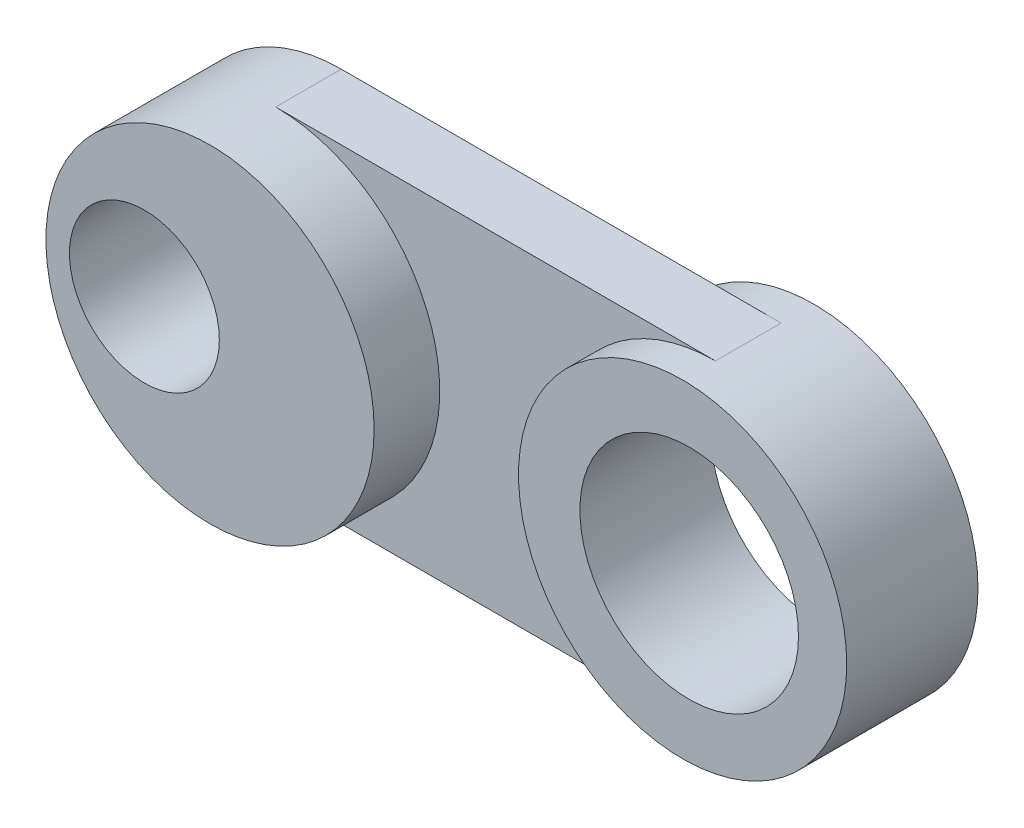
ISO-10303-21;
HEADER;
FILE_DESCRIPTION(('STEP AP214'),'2;1');
FILE_NAME('part.step','',(''),(''),'','','');
FILE_SCHEMA(('AUTOMOTIVE_DESIGN { 1 0 10303 214 1 1 1 1 }'));
ENDSEC;
DATA;
#1=APPLICATION_CONTEXT('core data for automotive mechanical design processes');
#2=APPLICATION_PROTOCOL_DEFINITION('international standard','automotive_design',2000,#1);
#3=PRODUCT_CONTEXT('',#1,'mechanical');
#4=PRODUCT('Part','Part','',(#3));
#5=PRODUCT_RELATED_PRODUCT_CATEGORY('part','',(#4));
#6=PRODUCT_DEFINITION_FORMATION('','',#4);
#7=PRODUCT_DEFINITION_CONTEXT('part definition',#1,'design');
#8=PRODUCT_DEFINITION('design','',#6,#7);
#9=PRODUCT_DEFINITION_SHAPE('','',#8);
#10=(LENGTH_UNIT() NAMED_UNIT(*) SI_UNIT(.MILLI.,.METRE.));
#11=(NAMED_UNIT(*) PLANE_ANGLE_UNIT() SI_UNIT($,.RADIAN.));
#12=(NAMED_UNIT(*) SI_UNIT($,.STERADIAN.) SOLID_ANGLE_UNIT());
#13=UNCERTAINTY_MEASURE_WITH_UNIT(LENGTH_MEASURE(1.E-05),#10,'distance_accuracy_value','');
#14=(GEOMETRIC_REPRESENTATION_CONTEXT(3) GLOBAL_UNCERTAINTY_ASSIGNED_CONTEXT((#13)) GLOBAL_UNIT_ASSIGNED_CONTEXT((#10,
#11,#12)) REPRESENTATION_CONTEXT('',''));
#15=CARTESIAN_POINT('',(0.,0.,0.));
#16=DIRECTION('',(0.,0.,1.));
#17=DIRECTION('',(1.,0.,0.));
#18=AXIS2_PLACEMENT_3D('',#15,#16,#17);
#19=CARTESIAN_POINT('',(0.,6.35,1.27));
#20=DIRECTION('',(0.,0.,-1.));
#21=DIRECTION('',(-1.,0.,0.));
#22=AXIS2_PLACEMENT_3D('',#19,#20,#21);
#23=PLANE('',#22);
#24=CARTESIAN_POINT('',(17.018,6.35,1.27));
#25=DIRECTION('',(0.,0.,-1.));
#26=DIRECTION('',(-1.,0.,0.));
#27=AXIS2_PLACEMENT_3D('',#24,#25,#26);
#28=CIRCLE('',#27,6.35);
#29=CARTESIAN_POINT('',(17.018,12.7,1.27));
#30=VERTEX_POINT('',#29);
#31=CARTESIAN_POINT('',(17.018,0.,1.27));
#32=VERTEX_POINT('',#31);
#33=EDGE_CURVE('E64',#30,#32,#28,.F.);
#34=ORIENTED_EDGE('',*,*,#33,.F.);
#35=DIRECTION('',(-1.,0.,0.));
#36=VECTOR('',#35,1.);
#37=CARTESIAN_POINT('',(0.,12.7,1.27));
#38=LINE('',#37,#36);
#39=CARTESIAN_POINT('',(0.,12.7,1.27));
#40=VERTEX_POINT('',#39);
#41=EDGE_CURVE('E102',#30,#40,#38,.T.);
#42=ORIENTED_EDGE('',*,*,#41,.T.);
#43=CARTESIAN_POINT('',(0.,6.35,1.27));
#44=DIRECTION('',(0.,0.,1.));
#45=DIRECTION('',(1.,0.,0.));
#46=AXIS2_PLACEMENT_3D('',#43,#44,#45);
#47=CIRCLE('',#46,6.35);
#48=CARTESIAN_POINT('',(0.,0.,1.27));
#49=VERTEX_POINT('',#48);
#50=EDGE_CURVE('E11',#49,#40,#47,.T.);
#51=ORIENTED_EDGE('',*,*,#50,.F.);
#52=DIRECTION('',(1.,0.,0.));
#53=VECTOR('',#52,1.);
#54=CARTESIAN_POINT('',(0.,0.,1.27));
#55=LINE('',#54,#53);
#56=EDGE_CURVE('E93',#49,#32,#55,.T.);
#57=ORIENTED_EDGE('',*,*,#56,.T.);
#58=EDGE_LOOP('',(#34,#42,#51,#57));
#59=FACE_BOUND('',#58,.T.);
#60=ADVANCED_FACE('F45',(#59),#23,.F.);
#61=CARTESIAN_POINT('',(0.,6.35,-1.27));
#62=DIRECTION('',(0.,0.,-1.));
#63=DIRECTION('',(-1.,0.,0.));
#64=AXIS2_PLACEMENT_3D('',#61,#62,#63);
#65=PLANE('',#64);
#66=CARTESIAN_POINT('',(-2.54,6.35,-1.27));
#67=DIRECTION('',(0.,0.,1.));
#68=DIRECTION('',(1.,0.,0.));
#69=AXIS2_PLACEMENT_3D('',#66,#67,#68);
#70=CIRCLE('',#69,2.9);
#71=CARTESIAN_POINT('',(0.36,6.35,-1.27));
#72=VERTEX_POINT('',#71);
#73=EDGE_CURVE('E107',#72,#72,#70,.T.);
#74=ORIENTED_EDGE('',*,*,#73,.T.);
#75=EDGE_LOOP('',(#74));
#76=FACE_BOUND('',#75,.T.);
#77=DIRECTION('',(-1.,0.,0.));
#78=VECTOR('',#77,1.);
#79=CARTESIAN_POINT('',(0.,12.7,-1.27));
#80=LINE('',#79,#78);
#81=CARTESIAN_POINT('',(17.018,12.7,-1.27));
#82=VERTEX_POINT('',#81);
#83=CARTESIAN_POINT('',(0.,12.7,-1.27));
#84=VERTEX_POINT('',#83);
#85=EDGE_CURVE('E84',#82,#84,#80,.T.);
#86=ORIENTED_EDGE('',*,*,#85,.F.);
#87=CARTESIAN_POINT('',(17.018,6.35,-1.27));
#88=DIRECTION('',(0.,0.,-1.));
#89=DIRECTION('',(-1.,0.,0.));
#90=AXIS2_PLACEMENT_3D('',#87,#88,#89);
#91=CIRCLE('',#90,6.35);
#92=CARTESIAN_POINT('',(17.018,0.,-1.27));
#93=VERTEX_POINT('',#92);
#94=EDGE_CURVE('E78',#82,#93,#91,.F.);
#95=ORIENTED_EDGE('',*,*,#94,.T.);
#96=DIRECTION('',(1.,0.,0.));
#97=VECTOR('',#96,1.);
#98=CARTESIAN_POINT('',(0.,0.,-1.27));
#99=LINE('',#98,#97);
#100=CARTESIAN_POINT('',(0.,0.,-1.27));
#101=VERTEX_POINT('',#100);
#102=EDGE_CURVE('E94',#101,#93,#99,.T.);
#103=ORIENTED_EDGE('',*,*,#102,.F.);
#104=CARTESIAN_POINT('',(0.,6.35,-1.27));
#105=DIRECTION('',(0.,0.,1.));
#106=DIRECTION('',(-1.,0.,0.));
#107=AXIS2_PLACEMENT_3D('',#104,#105,#106);
#108=CIRCLE('',#107,6.35);
#109=EDGE_CURVE('E100',#84,#101,#108,.T.);
#110=ORIENTED_EDGE('',*,*,#109,.F.);
#111=EDGE_LOOP('',(#86,#95,#103,#110));
#112=FACE_BOUND('',#111,.T.);
#113=ADVANCED_FACE('F104',(#76,#112),#65,.T.);
#114=CARTESIAN_POINT('',(0.,6.35,1.27));
#115=DIRECTION('',(0.,0.,-1.));
#116=DIRECTION('',(-1.,0.,0.));
#117=AXIS2_PLACEMENT_3D('',#114,#115,#116);
#118=CYLINDRICAL_SURFACE('',#117,6.35);
#119=ORIENTED_EDGE('',*,*,#109,.T.);
#120=DIRECTION('',(0.,0.,-1.));
#121=VECTOR('',#120,1.);
#122=CARTESIAN_POINT('',(0.,0.,1.27));
#123=LINE('',#122,#121);
#124=EDGE_CURVE('E49',#49,#101,#123,.T.);
#125=ORIENTED_EDGE('',*,*,#124,.F.);
#126=ORIENTED_EDGE('',*,*,#50,.T.);
#127=DIRECTION('',(0.,0.,-1.));
#128=VECTOR('',#127,1.);
#129=CARTESIAN_POINT('',(0.,12.7,1.27));
#130=LINE('',#129,#128);
#131=EDGE_CURVE('E88',#40,#84,#130,.T.);
#132=ORIENTED_EDGE('',*,*,#131,.T.);
#133=EDGE_LOOP('',(#119,#125,#126,#132));
#134=FACE_BOUND('',#133,.T.);
#135=CARTESIAN_POINT('',(0.,6.35,3.81));
#136=DIRECTION('',(0.,0.,1.));
#137=DIRECTION('',(1.,0.,0.));
#138=AXIS2_PLACEMENT_3D('',#135,#136,#137);
#139=CIRCLE('',#138,6.35);
#140=CARTESIAN_POINT('',(6.35,6.35,3.81));
#141=VERTEX_POINT('',#140);
#142=EDGE_CURVE('E113',#141,#141,#139,.T.);
#143=ORIENTED_EDGE('',*,*,#142,.F.);
#144=EDGE_LOOP('',(#143));
#145=FACE_BOUND('',#144,.T.);
#146=ADVANCED_FACE('F47',(#134,#145),#118,.T.);
#147=CARTESIAN_POINT('',(0.,0.,1.27));
#148=DIRECTION('',(0.,1.,0.));
#149=DIRECTION('',(-1.,0.,0.));
#150=AXIS2_PLACEMENT_3D('',#147,#148,#149);
#151=PLANE('',#150);
#152=ORIENTED_EDGE('',*,*,#102,.T.);
#153=DIRECTION('',(0.,0.,-1.));
#154=VECTOR('',#153,1.);
#155=CARTESIAN_POINT('',(17.018,0.,1.27));
#156=LINE('',#155,#154);
#157=EDGE_CURVE('E119',#32,#93,#156,.T.);
#158=ORIENTED_EDGE('',*,*,#157,.F.);
#159=ORIENTED_EDGE('',*,*,#56,.F.);
#160=ORIENTED_EDGE('',*,*,#124,.T.);
#161=EDGE_LOOP('',(#152,#158,#159,#160));
#162=FACE_BOUND('',#161,.T.);
#163=ADVANCED_FACE('F127',(#162),#151,.F.);
#164=CARTESIAN_POINT('',(17.018,6.35,1.27));
#165=DIRECTION('',(0.,0.,-1.));
#166=DIRECTION('',(-1.,0.,0.));
#167=AXIS2_PLACEMENT_3D('',#164,#165,#166);
#168=CYLINDRICAL_SURFACE('',#167,6.35);
#169=ORIENTED_EDGE('',*,*,#157,.T.);
#170=ORIENTED_EDGE('',*,*,#94,.F.);
#171=DIRECTION('',(0.,0.,-1.));
#172=VECTOR('',#171,1.);
#173=CARTESIAN_POINT('',(17.018,12.7,1.27));
#174=LINE('',#173,#172);
#175=EDGE_CURVE('E90',#30,#82,#174,.T.);
#176=ORIENTED_EDGE('',*,*,#175,.F.);
#177=ORIENTED_EDGE('',*,*,#33,.T.);
#178=EDGE_LOOP('',(#169,#170,#176,#177));
#179=FACE_BOUND('',#178,.T.);
#180=CARTESIAN_POINT('',(17.018,6.35,-2.54));
#181=DIRECTION('',(0.,0.,1.));
#182=DIRECTION('',(1.,0.,0.));
#183=AXIS2_PLACEMENT_3D('',#180,#181,#182);
#184=CIRCLE('',#183,6.35);
#185=CARTESIAN_POINT('',(23.368,6.35,-2.54));
#186=VERTEX_POINT('',#185);
#187=EDGE_CURVE('E144',#186,#186,#184,.T.);
#188=ORIENTED_EDGE('',*,*,#187,.T.);
#189=EDGE_LOOP('',(#188));
#190=FACE_BOUND('',#189,.T.);
#191=CARTESIAN_POINT('',(17.018,6.35,2.54));
#192=DIRECTION('',(0.,0.,1.));
#193=DIRECTION('',(1.,0.,0.));
#194=AXIS2_PLACEMENT_3D('',#191,#192,#193);
#195=CIRCLE('',#194,6.35);
#196=CARTESIAN_POINT('',(23.368,6.35,2.54));
#197=VERTEX_POINT('',#196);
#198=EDGE_CURVE('E143',#197,#197,#195,.T.);
#199=ORIENTED_EDGE('',*,*,#198,.F.);
#200=EDGE_LOOP('',(#199));
#201=FACE_BOUND('',#200,.T.);
#202=ADVANCED_FACE('F185',(#179,#190,#201),#168,.T.);
#203=CARTESIAN_POINT('',(0.,12.7,1.27));
#204=DIRECTION('',(0.,-1.,0.));
#205=DIRECTION('',(1.,0.,0.));
#206=AXIS2_PLACEMENT_3D('',#203,#204,#205);
#207=PLANE('',#206);
#208=ORIENTED_EDGE('',*,*,#85,.T.);
#209=ORIENTED_EDGE('',*,*,#131,.F.);
#210=ORIENTED_EDGE('',*,*,#41,.F.);
#211=ORIENTED_EDGE('',*,*,#175,.T.);
#212=EDGE_LOOP('',(#208,#209,#210,#211));
#213=FACE_BOUND('',#212,.T.);
#214=ADVANCED_FACE('F86',(#213),#207,.F.);
#215=CARTESIAN_POINT('',(-2.54,6.35,1.27));
#216=DIRECTION('',(0.,0.,-1.));
#217=DIRECTION('',(-1.,0.,0.));
#218=AXIS2_PLACEMENT_3D('',#215,#216,#217);
#219=CYLINDRICAL_SURFACE('',#218,2.9);
#220=ORIENTED_EDGE('',*,*,#73,.F.);
#221=EDGE_LOOP('',(#220));
#222=FACE_BOUND('',#221,.T.);
#223=CARTESIAN_POINT('',(-2.54,6.35,3.81));
#224=DIRECTION('',(0.,0.,1.));
#225=DIRECTION('',(1.,0.,0.));
#226=AXIS2_PLACEMENT_3D('',#223,#224,#225);
#227=CIRCLE('',#226,2.9);
#228=CARTESIAN_POINT('',(0.36,6.35,3.81));
#229=VERTEX_POINT('',#228);
#230=EDGE_CURVE('E135',#229,#229,#227,.F.);
#231=ORIENTED_EDGE('',*,*,#230,.F.);
#232=EDGE_LOOP('',(#231));
#233=FACE_BOUND('',#232,.T.);
#234=ADVANCED_FACE('F184',(#222,#233),#219,.F.);
#235=CARTESIAN_POINT('',(0.,0.,3.81));
#236=DIRECTION('',(0.,0.,1.));
#237=DIRECTION('',(1.,0.,0.));
#238=AXIS2_PLACEMENT_3D('',#235,#236,#237);
#239=PLANE('',#238);
#240=ORIENTED_EDGE('',*,*,#230,.T.);
#241=EDGE_LOOP('',(#240));
#242=FACE_BOUND('',#241,.T.);
#243=ORIENTED_EDGE('',*,*,#142,.T.);
#244=EDGE_LOOP('',(#243));
#245=FACE_BOUND('',#244,.T.);
#246=ADVANCED_FACE('F232',(#242,#245),#239,.T.);
#247=CARTESIAN_POINT('',(17.018,6.35,-2.54));
#248=DIRECTION('',(0.,0.,1.));
#249=DIRECTION('',(1.,0.,0.));
#250=AXIS2_PLACEMENT_3D('',#247,#248,#249);
#251=PLANE('',#250);
#252=ORIENTED_EDGE('',*,*,#187,.F.);
#253=EDGE_LOOP('',(#252));
#254=FACE_BOUND('',#253,.T.);
#255=CARTESIAN_POINT('',(17.272,6.35,-2.54));
#256=DIRECTION('',(0.,0.,1.));
#257=DIRECTION('',(1.,0.,0.));
#258=AXIS2_PLACEMENT_3D('',#255,#256,#257);
#259=CIRCLE('',#258,4.2291);
#260=CARTESIAN_POINT('',(21.5011,6.35,-2.54));
#261=VERTEX_POINT('',#260);
#262=EDGE_CURVE('E152',#261,#261,#259,.T.);
#263=ORIENTED_EDGE('',*,*,#262,.T.);
#264=EDGE_LOOP('',(#263));
#265=FACE_BOUND('',#264,.T.);
#266=ADVANCED_FACE('F169',(#254,#265),#251,.F.);
#267=CARTESIAN_POINT('',(17.272,6.35,1.27));
#268=DIRECTION('',(0.,0.,-1.));
#269=DIRECTION('',(-1.,0.,0.));
#270=AXIS2_PLACEMENT_3D('',#267,#268,#269);
#271=CYLINDRICAL_SURFACE('',#270,4.2291);
#272=ORIENTED_EDGE('',*,*,#262,.F.);
#273=EDGE_LOOP('',(#272));
#274=FACE_BOUND('',#273,.T.);
#275=CARTESIAN_POINT('',(17.272,6.35,2.54));
#276=DIRECTION('',(0.,0.,1.));
#277=DIRECTION('',(1.,0.,0.));
#278=AXIS2_PLACEMENT_3D('',#275,#276,#277);
#279=CIRCLE('',#278,4.2291);
#280=CARTESIAN_POINT('',(21.5011,6.35,2.54));
#281=VERTEX_POINT('',#280);
#282=EDGE_CURVE('E148',#281,#281,#279,.T.);
#283=ORIENTED_EDGE('',*,*,#282,.T.);
#284=EDGE_LOOP('',(#283));
#285=FACE_BOUND('',#284,.T.);
#286=ADVANCED_FACE('F160',(#274,#285),#271,.F.);
#287=CARTESIAN_POINT('',(17.018,6.35,2.54));
#288=DIRECTION('',(0.,0.,1.));
#289=DIRECTION('',(1.,0.,0.));
#290=AXIS2_PLACEMENT_3D('',#287,#288,#289);
#291=PLANE('',#290);
#292=ORIENTED_EDGE('',*,*,#198,.T.);
#293=EDGE_LOOP('',(#292));
#294=FACE_BOUND('',#293,.T.);
#295=ORIENTED_EDGE('',*,*,#282,.F.);
#296=EDGE_LOOP('',(#295));
#297=FACE_BOUND('',#296,.T.);
#298=ADVANCED_FACE('F162',(#294,#297),#291,.T.);
#299=CLOSED_SHELL('',(#60,#113,#146,#163,#202,#214,#234,#246,#266,#286,#298));
#300=MANIFOLD_SOLID_BREP('B2',#299);
#301=ADVANCED_BREP_SHAPE_REPRESENTATION('',(#18,#300),#14);
#302=SHAPE_DEFINITION_REPRESENTATION(#9,#301);
ENDSEC;
END-ISO-10303-21;
